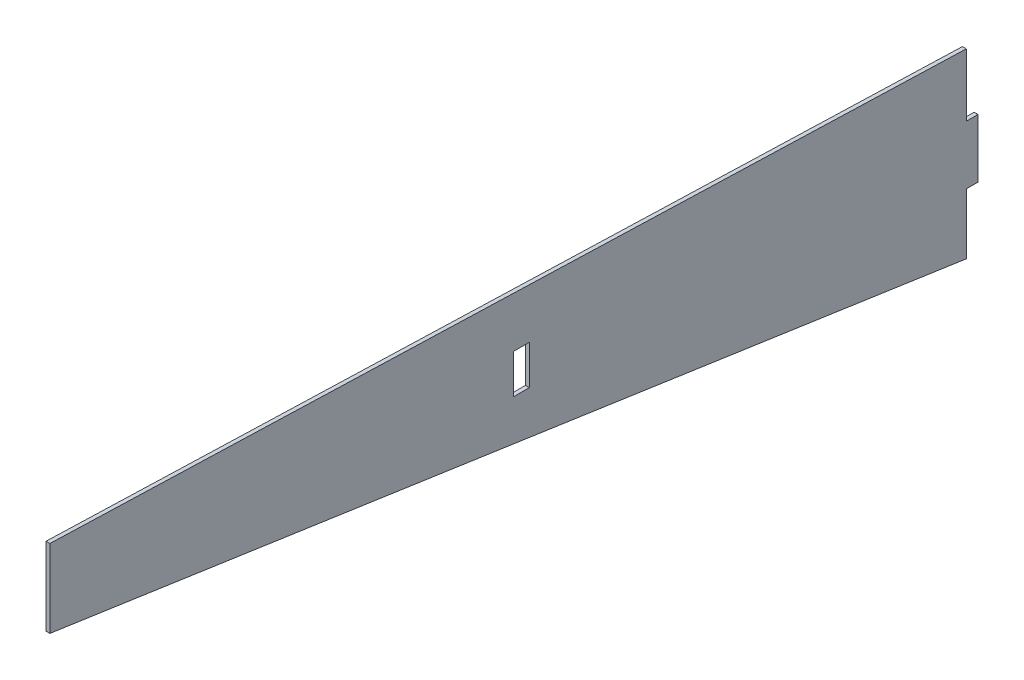
ISO-10303-21;
HEADER;
FILE_DESCRIPTION(('STEP AP214'),'2;1');
FILE_NAME('part.step','',(''),(''),'','','');
FILE_SCHEMA(('AUTOMOTIVE_DESIGN { 1 0 10303 214 1 1 1 1 }'));
ENDSEC;
DATA;
#1=APPLICATION_CONTEXT('core data for automotive mechanical design processes');
#2=APPLICATION_PROTOCOL_DEFINITION('international standard','automotive_design',2000,#1);
#3=PRODUCT_CONTEXT('',#1,'mechanical');
#4=PRODUCT('Part','Part','',(#3));
#5=PRODUCT_RELATED_PRODUCT_CATEGORY('part','',(#4));
#6=PRODUCT_DEFINITION_FORMATION('','',#4);
#7=PRODUCT_DEFINITION_CONTEXT('part definition',#1,'design');
#8=PRODUCT_DEFINITION('design','',#6,#7);
#9=PRODUCT_DEFINITION_SHAPE('','',#8);
#10=(LENGTH_UNIT() NAMED_UNIT(*) SI_UNIT(.MILLI.,.METRE.));
#11=(NAMED_UNIT(*) PLANE_ANGLE_UNIT() SI_UNIT($,.RADIAN.));
#12=(NAMED_UNIT(*) SI_UNIT($,.STERADIAN.) SOLID_ANGLE_UNIT());
#13=UNCERTAINTY_MEASURE_WITH_UNIT(LENGTH_MEASURE(1.E-05),#10,'distance_accuracy_value','');
#14=(GEOMETRIC_REPRESENTATION_CONTEXT(3) GLOBAL_UNCERTAINTY_ASSIGNED_CONTEXT((#13)) GLOBAL_UNIT_ASSIGNED_CONTEXT((#10,
#11,#12)) REPRESENTATION_CONTEXT('',''));
#15=CARTESIAN_POINT('',(0.,0.,0.));
#16=DIRECTION('',(0.,0.,1.));
#17=DIRECTION('',(1.,0.,0.));
#18=AXIS2_PLACEMENT_3D('',#15,#16,#17);
#19=CARTESIAN_POINT('',(1.5875,-55.2341153332028,-378.259807403515));
#20=DIRECTION('',(0.,0.98950635767407,-0.144489335670822));
#21=DIRECTION('',(0.,0.144489335670822,0.98950635767407));
#22=AXIS2_PLACEMENT_3D('',#19,#20,#21);
#23=PLANE('',#22);
#24=DIRECTION('',(0.,-0.144489335670822,-0.98950635767407));
#25=VECTOR('',#24,1.);
#26=CARTESIAN_POINT('',(0.,-55.2341153332028,-378.259807403515));
#27=LINE('',#26,#25);
#28=CARTESIAN_POINT('',(0.,0.,0.));
#29=VERTEX_POINT('',#28);
#30=CARTESIAN_POINT('',(0.,-54.5386872990163,-373.497307403515));
#31=VERTEX_POINT('',#30);
#32=EDGE_CURVE('E175',#29,#31,#27,.T.);
#33=ORIENTED_EDGE('',*,*,#32,.T.);
#34=DIRECTION('',(1.,0.,0.));
#35=VECTOR('',#34,1.);
#36=CARTESIAN_POINT('',(0.,-54.5386872990163,-373.497307403515));
#37=LINE('',#36,#35);
#38=CARTESIAN_POINT('',(1.5875,-54.5386872990163,-373.497307403515));
#39=VERTEX_POINT('',#38);
#40=EDGE_CURVE('E172',#31,#39,#37,.T.);
#41=ORIENTED_EDGE('',*,*,#40,.T.);
#42=DIRECTION('',(0.,-0.144489335670822,-0.98950635767407));
#43=VECTOR('',#42,1.);
#44=CARTESIAN_POINT('',(1.5875,-55.2341153332028,-378.259807403515));
#45=LINE('',#44,#43);
#46=CARTESIAN_POINT('',(1.5875,0.,0.));
#47=VERTEX_POINT('',#46);
#48=EDGE_CURVE('E195',#47,#39,#45,.T.);
#49=ORIENTED_EDGE('',*,*,#48,.F.);
#50=DIRECTION('',(-1.,0.,0.));
#51=VECTOR('',#50,1.);
#52=CARTESIAN_POINT('',(1.5875,0.,0.));
#53=LINE('',#52,#51);
#54=EDGE_CURVE('E40',#47,#29,#53,.T.);
#55=ORIENTED_EDGE('',*,*,#54,.T.);
#56=EDGE_LOOP('',(#33,#41,#49,#55));
#57=FACE_BOUND('',#56,.T.);
#58=ADVANCED_FACE('F33',(#57),#23,.F.);
#59=CARTESIAN_POINT('',(1.5875,19.4418846667972,-378.259807403515));
#60=DIRECTION('',(0.,0.,1.));
#61=DIRECTION('',(1.,0.,0.));
#62=AXIS2_PLACEMENT_3D('',#59,#60,#61);
#63=PLANE('',#62);
#64=DIRECTION('',(0.,1.,0.));
#65=VECTOR('',#64,1.);
#66=CARTESIAN_POINT('',(1.5875,19.4418846667972,-378.259807403515));
#67=LINE('',#66,#65);
#68=CARTESIAN_POINT('',(1.5875,-29.8341153332028,-378.259807403515));
#69=VERTEX_POINT('',#68);
#70=CARTESIAN_POINT('',(1.5875,-5.95811533320283,-378.259807403515));
#71=VERTEX_POINT('',#70);
#72=EDGE_CURVE('E198',#69,#71,#67,.T.);
#73=ORIENTED_EDGE('',*,*,#72,.F.);
#74=DIRECTION('',(1.,0.,0.));
#75=VECTOR('',#74,1.);
#76=CARTESIAN_POINT('',(0.,-29.8341153332028,-378.259807403515));
#77=LINE('',#76,#75);
#78=CARTESIAN_POINT('',(0.,-29.8341153332028,-378.259807403515));
#79=VERTEX_POINT('',#78);
#80=EDGE_CURVE('E166',#79,#69,#77,.T.);
#81=ORIENTED_EDGE('',*,*,#80,.F.);
#82=DIRECTION('',(0.,1.,0.));
#83=VECTOR('',#82,1.);
#84=CARTESIAN_POINT('',(0.,19.4418846667972,-378.259807403515));
#85=LINE('',#84,#83);
#86=CARTESIAN_POINT('',(0.,-5.95811533320283,-378.259807403515));
#87=VERTEX_POINT('',#86);
#88=EDGE_CURVE('E208',#79,#87,#85,.T.);
#89=ORIENTED_EDGE('',*,*,#88,.T.);
#90=DIRECTION('',(1.,0.,0.));
#91=VECTOR('',#90,1.);
#92=CARTESIAN_POINT('',(0.,-5.95811533320283,-378.259807403515));
#93=LINE('',#92,#91);
#94=EDGE_CURVE('E170',#87,#71,#93,.T.);
#95=ORIENTED_EDGE('',*,*,#94,.T.);
#96=EDGE_LOOP('',(#73,#81,#89,#95));
#97=FACE_BOUND('',#96,.T.);
#98=ADVANCED_FACE('F248',(#97),#63,.F.);
#99=CARTESIAN_POINT('',(1.5875,31.75,0.));
#100=DIRECTION('',(0.,-0.999471033672027,0.0325215751551097));
#101=DIRECTION('',(0.,-0.0325215751551097,-0.999471033672027));
#102=AXIS2_PLACEMENT_3D('',#99,#100,#101);
#103=PLANE('',#102);
#104=DIRECTION('',(0.,0.0325215751551097,0.999471033672027));
#105=VECTOR('',#104,1.);
#106=CARTESIAN_POINT('',(1.5875,31.75,0.));
#107=LINE('',#106,#105);
#108=CARTESIAN_POINT('',(1.5875,19.5968506402553,-373.497307403515));
#109=VERTEX_POINT('',#108);
#110=CARTESIAN_POINT('',(1.5875,31.75,0.));
#111=VERTEX_POINT('',#110);
#112=EDGE_CURVE('E202',#109,#111,#107,.T.);
#113=ORIENTED_EDGE('',*,*,#112,.F.);
#114=DIRECTION('',(1.,0.,0.));
#115=VECTOR('',#114,1.);
#116=CARTESIAN_POINT('',(0.,19.5968506402553,-373.497307403515));
#117=LINE('',#116,#115);
#118=CARTESIAN_POINT('',(0.,19.5968506402553,-373.497307403515));
#119=VERTEX_POINT('',#118);
#120=EDGE_CURVE('E186',#119,#109,#117,.T.);
#121=ORIENTED_EDGE('',*,*,#120,.F.);
#122=DIRECTION('',(0.,0.0325215751551097,0.999471033672027));
#123=VECTOR('',#122,1.);
#124=CARTESIAN_POINT('',(0.,31.75,0.));
#125=LINE('',#124,#123);
#126=CARTESIAN_POINT('',(0.,31.75,0.));
#127=VERTEX_POINT('',#126);
#128=EDGE_CURVE('E211',#119,#127,#125,.T.);
#129=ORIENTED_EDGE('',*,*,#128,.T.);
#130=DIRECTION('',(-1.,0.,0.));
#131=VECTOR('',#130,1.);
#132=CARTESIAN_POINT('',(1.5875,31.75,0.));
#133=LINE('',#132,#131);
#134=EDGE_CURVE('E11',#111,#127,#133,.T.);
#135=ORIENTED_EDGE('',*,*,#134,.F.);
#136=EDGE_LOOP('',(#113,#121,#129,#135));
#137=FACE_BOUND('',#136,.T.);
#138=ADVANCED_FACE('F239',(#137),#103,.F.);
#139=CARTESIAN_POINT('',(1.5875,0.,0.));
#140=DIRECTION('',(0.,0.,-1.));
#141=DIRECTION('',(-1.,0.,0.));
#142=AXIS2_PLACEMENT_3D('',#139,#140,#141);
#143=PLANE('',#142);
#144=DIRECTION('',(0.,-1.,0.));
#145=VECTOR('',#144,1.);
#146=CARTESIAN_POINT('',(0.,0.,0.));
#147=LINE('',#146,#145);
#148=EDGE_CURVE('E199',#127,#29,#147,.T.);
#149=ORIENTED_EDGE('',*,*,#148,.T.);
#150=ORIENTED_EDGE('',*,*,#54,.F.);
#151=DIRECTION('',(0.,-1.,0.));
#152=VECTOR('',#151,1.);
#153=CARTESIAN_POINT('',(1.5875,0.,0.));
#154=LINE('',#153,#152);
#155=EDGE_CURVE('E204',#111,#47,#154,.T.);
#156=ORIENTED_EDGE('',*,*,#155,.F.);
#157=ORIENTED_EDGE('',*,*,#134,.T.);
#158=EDGE_LOOP('',(#149,#150,#156,#157));
#159=FACE_BOUND('',#158,.T.);
#160=ADVANCED_FACE('F237',(#159),#143,.F.);
#161=CARTESIAN_POINT('',(1.5875,0.,0.));
#162=DIRECTION('',(-1.,0.,0.));
#163=DIRECTION('',(0.,0.,1.));
#164=AXIS2_PLACEMENT_3D('',#161,#162,#163);
#165=PLANE('',#164);
#166=DIRECTION('',(0.,0.,-1.));
#167=VECTOR('',#166,1.);
#168=CARTESIAN_POINT('',(1.5875,-10.9401762368486,-189.029807403515));
#169=LINE('',#168,#167);
#170=CARTESIAN_POINT('',(1.5875,-10.9401762368486,-189.029807403515));
#171=VERTEX_POINT('',#170);
#172=CARTESIAN_POINT('',(1.5875,-10.9401762368486,-195.379807403515));
#173=VERTEX_POINT('',#172);
#174=EDGE_CURVE('E145',#171,#173,#169,.T.);
#175=ORIENTED_EDGE('',*,*,#174,.F.);
#176=DIRECTION('',(0.,-1.,0.));
#177=VECTOR('',#176,1.);
#178=CARTESIAN_POINT('',(1.5875,5.06182376315141,-189.029807403515));
#179=LINE('',#178,#177);
#180=CARTESIAN_POINT('',(1.5875,5.06182376315141,-189.029807403515));
#181=VERTEX_POINT('',#180);
#182=EDGE_CURVE('E138',#181,#171,#179,.T.);
#183=ORIENTED_EDGE('',*,*,#182,.F.);
#184=DIRECTION('',(0.,0.,1.));
#185=VECTOR('',#184,1.);
#186=CARTESIAN_POINT('',(1.5875,5.0618237631514,-195.379807403515));
#187=LINE('',#186,#185);
#188=CARTESIAN_POINT('',(1.5875,5.0618237631514,-195.379807403515));
#189=VERTEX_POINT('',#188);
#190=EDGE_CURVE('E149',#189,#181,#187,.T.);
#191=ORIENTED_EDGE('',*,*,#190,.F.);
#192=DIRECTION('',(0.,1.,0.));
#193=VECTOR('',#192,1.);
#194=CARTESIAN_POINT('',(1.5875,-10.9401762368486,-195.379807403515));
#195=LINE('',#194,#193);
#196=EDGE_CURVE('E47',#173,#189,#195,.T.);
#197=ORIENTED_EDGE('',*,*,#196,.F.);
#198=EDGE_LOOP('',(#175,#183,#191,#197));
#199=FACE_BOUND('',#198,.T.);
#200=ORIENTED_EDGE('',*,*,#48,.T.);
#201=DIRECTION('',(0.,-1.,0.));
#202=VECTOR('',#201,1.);
#203=CARTESIAN_POINT('',(1.5875,-29.8341153332028,-373.497307403515));
#204=LINE('',#203,#202);
#205=CARTESIAN_POINT('',(1.5875,-29.8341153332028,-373.497307403515));
#206=VERTEX_POINT('',#205);
#207=EDGE_CURVE('E163',#206,#39,#204,.T.);
#208=ORIENTED_EDGE('',*,*,#207,.F.);
#209=DIRECTION('',(0.,0.,1.));
#210=VECTOR('',#209,1.);
#211=CARTESIAN_POINT('',(1.5875,-29.8341153332028,-378.259807403515));
#212=LINE('',#211,#210);
#213=EDGE_CURVE('E167',#69,#206,#212,.T.);
#214=ORIENTED_EDGE('',*,*,#213,.F.);
#215=ORIENTED_EDGE('',*,*,#72,.T.);
#216=DIRECTION('',(0.,0.,-1.));
#217=VECTOR('',#216,1.);
#218=CARTESIAN_POINT('',(1.5875,-5.95811533320283,-373.497307403515));
#219=LINE('',#218,#217);
#220=CARTESIAN_POINT('',(1.5875,-5.95811533320283,-373.497307403515));
#221=VERTEX_POINT('',#220);
#222=EDGE_CURVE('E183',#221,#71,#219,.T.);
#223=ORIENTED_EDGE('',*,*,#222,.F.);
#224=DIRECTION('',(0.,-1.,0.));
#225=VECTOR('',#224,1.);
#226=CARTESIAN_POINT('',(1.5875,19.5968506402553,-373.497307403515));
#227=LINE('',#226,#225);
#228=EDGE_CURVE('E158',#109,#221,#227,.T.);
#229=ORIENTED_EDGE('',*,*,#228,.F.);
#230=ORIENTED_EDGE('',*,*,#112,.T.);
#231=ORIENTED_EDGE('',*,*,#155,.T.);
#232=EDGE_LOOP('',(#200,#208,#214,#215,#223,#229,#230,#231));
#233=FACE_BOUND('',#232,.T.);
#234=ADVANCED_FACE('F233',(#199,#233),#165,.F.);
#235=CARTESIAN_POINT('',(0.,0.,0.));
#236=DIRECTION('',(-1.,0.,0.));
#237=DIRECTION('',(0.,0.,1.));
#238=AXIS2_PLACEMENT_3D('',#235,#236,#237);
#239=PLANE('',#238);
#240=DIRECTION('',(0.,-1.,0.));
#241=VECTOR('',#240,1.);
#242=CARTESIAN_POINT('',(0.,5.06182376315141,-189.029807403515));
#243=LINE('',#242,#241);
#244=CARTESIAN_POINT('',(0.,5.06182376315141,-189.029807403515));
#245=VERTEX_POINT('',#244);
#246=CARTESIAN_POINT('',(0.,-10.9401762368486,-189.029807403515));
#247=VERTEX_POINT('',#246);
#248=EDGE_CURVE('E135',#245,#247,#243,.T.);
#249=ORIENTED_EDGE('',*,*,#248,.T.);
#250=DIRECTION('',(0.,0.,-1.));
#251=VECTOR('',#250,1.);
#252=CARTESIAN_POINT('',(0.,-10.9401762368486,-189.029807403515));
#253=LINE('',#252,#251);
#254=CARTESIAN_POINT('',(0.,-10.9401762368486,-195.379807403515));
#255=VERTEX_POINT('',#254);
#256=EDGE_CURVE('E122',#247,#255,#253,.T.);
#257=ORIENTED_EDGE('',*,*,#256,.T.);
#258=DIRECTION('',(0.,1.,0.));
#259=VECTOR('',#258,1.);
#260=CARTESIAN_POINT('',(0.,-10.9401762368486,-195.379807403515));
#261=LINE('',#260,#259);
#262=CARTESIAN_POINT('',(0.,5.0618237631514,-195.379807403515));
#263=VERTEX_POINT('',#262);
#264=EDGE_CURVE('E153',#255,#263,#261,.T.);
#265=ORIENTED_EDGE('',*,*,#264,.T.);
#266=DIRECTION('',(0.,0.,1.));
#267=VECTOR('',#266,1.);
#268=CARTESIAN_POINT('',(0.,5.0618237631514,-195.379807403515));
#269=LINE('',#268,#267);
#270=EDGE_CURVE('E143',#263,#245,#269,.T.);
#271=ORIENTED_EDGE('',*,*,#270,.T.);
#272=EDGE_LOOP('',(#249,#257,#265,#271));
#273=FACE_BOUND('',#272,.T.);
#274=DIRECTION('',(0.,-1.,0.));
#275=VECTOR('',#274,1.);
#276=CARTESIAN_POINT('',(0.,-29.8341153332028,-373.497307403515));
#277=LINE('',#276,#275);
#278=CARTESIAN_POINT('',(0.,-29.8341153332028,-373.497307403515));
#279=VERTEX_POINT('',#278);
#280=EDGE_CURVE('E162',#279,#31,#277,.T.);
#281=ORIENTED_EDGE('',*,*,#280,.T.);
#282=ORIENTED_EDGE('',*,*,#32,.F.);
#283=ORIENTED_EDGE('',*,*,#148,.F.);
#284=ORIENTED_EDGE('',*,*,#128,.F.);
#285=DIRECTION('',(0.,-1.,0.));
#286=VECTOR('',#285,1.);
#287=CARTESIAN_POINT('',(0.,19.5968506402553,-373.497307403515));
#288=LINE('',#287,#286);
#289=CARTESIAN_POINT('',(0.,-5.95811533320283,-373.497307403515));
#290=VERTEX_POINT('',#289);
#291=EDGE_CURVE('E179',#119,#290,#288,.T.);
#292=ORIENTED_EDGE('',*,*,#291,.T.);
#293=DIRECTION('',(0.,0.,-1.));
#294=VECTOR('',#293,1.);
#295=CARTESIAN_POINT('',(0.,-5.95811533320283,-373.497307403515));
#296=LINE('',#295,#294);
#297=EDGE_CURVE('E182',#290,#87,#296,.T.);
#298=ORIENTED_EDGE('',*,*,#297,.T.);
#299=ORIENTED_EDGE('',*,*,#88,.F.);
#300=DIRECTION('',(0.,0.,1.));
#301=VECTOR('',#300,1.);
#302=CARTESIAN_POINT('',(0.,-29.8341153332028,-378.259807403515));
#303=LINE('',#302,#301);
#304=EDGE_CURVE('E159',#79,#279,#303,.T.);
#305=ORIENTED_EDGE('',*,*,#304,.T.);
#306=EDGE_LOOP('',(#281,#282,#283,#284,#292,#298,#299,#305));
#307=FACE_BOUND('',#306,.T.);
#308=ADVANCED_FACE('F141',(#273,#307),#239,.T.);
#309=CARTESIAN_POINT('',(0.,-5.95811533320283,-373.497307403515));
#310=DIRECTION('',(0.,-1.,0.));
#311=DIRECTION('',(0.,0.,-1.));
#312=AXIS2_PLACEMENT_3D('',#309,#310,#311);
#313=PLANE('',#312);
#314=ORIENTED_EDGE('',*,*,#222,.T.);
#315=ORIENTED_EDGE('',*,*,#94,.F.);
#316=ORIENTED_EDGE('',*,*,#297,.F.);
#317=DIRECTION('',(1.,0.,0.));
#318=VECTOR('',#317,1.);
#319=CARTESIAN_POINT('',(0.,-5.95811533320283,-373.497307403515));
#320=LINE('',#319,#318);
#321=EDGE_CURVE('E192',#290,#221,#320,.T.);
#322=ORIENTED_EDGE('',*,*,#321,.T.);
#323=EDGE_LOOP('',(#314,#315,#316,#322));
#324=FACE_BOUND('',#323,.T.);
#325=ADVANCED_FACE('F246',(#324),#313,.F.);
#326=CARTESIAN_POINT('',(0.,19.5968506402553,-373.497307403515));
#327=DIRECTION('',(0.,0.,1.));
#328=DIRECTION('',(1.,0.,0.));
#329=AXIS2_PLACEMENT_3D('',#326,#327,#328);
#330=PLANE('',#329);
#331=ORIENTED_EDGE('',*,*,#228,.T.);
#332=ORIENTED_EDGE('',*,*,#321,.F.);
#333=ORIENTED_EDGE('',*,*,#291,.F.);
#334=ORIENTED_EDGE('',*,*,#120,.T.);
#335=EDGE_LOOP('',(#331,#332,#333,#334));
#336=FACE_BOUND('',#335,.T.);
#337=ADVANCED_FACE('F243',(#336),#330,.F.);
#338=CARTESIAN_POINT('',(0.,-29.8341153332028,-373.497307403515));
#339=DIRECTION('',(0.,0.,1.));
#340=DIRECTION('',(1.,0.,0.));
#341=AXIS2_PLACEMENT_3D('',#338,#339,#340);
#342=PLANE('',#341);
#343=ORIENTED_EDGE('',*,*,#207,.T.);
#344=ORIENTED_EDGE('',*,*,#40,.F.);
#345=ORIENTED_EDGE('',*,*,#280,.F.);
#346=DIRECTION('',(1.,0.,0.));
#347=VECTOR('',#346,1.);
#348=CARTESIAN_POINT('',(0.,-29.8341153332028,-373.497307403515));
#349=LINE('',#348,#347);
#350=EDGE_CURVE('E176',#279,#206,#349,.T.);
#351=ORIENTED_EDGE('',*,*,#350,.T.);
#352=EDGE_LOOP('',(#343,#344,#345,#351));
#353=FACE_BOUND('',#352,.T.);
#354=ADVANCED_FACE('F225',(#353),#342,.F.);
#355=CARTESIAN_POINT('',(0.,-29.8341153332028,-378.259807403515));
#356=DIRECTION('',(0.,1.,0.));
#357=DIRECTION('',(0.,0.,1.));
#358=AXIS2_PLACEMENT_3D('',#355,#356,#357);
#359=PLANE('',#358);
#360=ORIENTED_EDGE('',*,*,#213,.T.);
#361=ORIENTED_EDGE('',*,*,#350,.F.);
#362=ORIENTED_EDGE('',*,*,#304,.F.);
#363=ORIENTED_EDGE('',*,*,#80,.T.);
#364=EDGE_LOOP('',(#360,#361,#362,#363));
#365=FACE_BOUND('',#364,.T.);
#366=ADVANCED_FACE('F227',(#365),#359,.F.);
#367=CARTESIAN_POINT('',(-17.2158794140758,5.06182376315141,-189.029807403515));
#368=DIRECTION('',(0.,0.,1.));
#369=DIRECTION('',(1.,0.,0.));
#370=AXIS2_PLACEMENT_3D('',#367,#368,#369);
#371=PLANE('',#370);
#372=DIRECTION('',(1.,0.,0.));
#373=VECTOR('',#372,1.);
#374=CARTESIAN_POINT('',(-17.2158794140758,5.06182376315141,-189.029807403515));
#375=LINE('',#374,#373);
#376=EDGE_CURVE('E55',#245,#181,#375,.T.);
#377=ORIENTED_EDGE('',*,*,#376,.T.);
#378=ORIENTED_EDGE('',*,*,#182,.T.);
#379=DIRECTION('',(1.,0.,0.));
#380=VECTOR('',#379,1.);
#381=CARTESIAN_POINT('',(-17.2158794140758,-10.9401762368486,-189.029807403515));
#382=LINE('',#381,#380);
#383=EDGE_CURVE('E126',#247,#171,#382,.T.);
#384=ORIENTED_EDGE('',*,*,#383,.F.);
#385=ORIENTED_EDGE('',*,*,#248,.F.);
#386=EDGE_LOOP('',(#377,#378,#384,#385));
#387=FACE_BOUND('',#386,.T.);
#388=ADVANCED_FACE('F134',(#387),#371,.F.);
#389=CARTESIAN_POINT('',(-17.2158794140758,-10.9401762368486,-189.029807403515));
#390=DIRECTION('',(0.,-1.,0.));
#391=DIRECTION('',(0.,0.,-1.));
#392=AXIS2_PLACEMENT_3D('',#389,#390,#391);
#393=PLANE('',#392);
#394=ORIENTED_EDGE('',*,*,#383,.T.);
#395=ORIENTED_EDGE('',*,*,#174,.T.);
#396=DIRECTION('',(1.,0.,0.));
#397=VECTOR('',#396,1.);
#398=CARTESIAN_POINT('',(-17.2158794140758,-10.9401762368486,-195.379807403515));
#399=LINE('',#398,#397);
#400=EDGE_CURVE('E128',#255,#173,#399,.T.);
#401=ORIENTED_EDGE('',*,*,#400,.F.);
#402=ORIENTED_EDGE('',*,*,#256,.F.);
#403=EDGE_LOOP('',(#394,#395,#401,#402));
#404=FACE_BOUND('',#403,.T.);
#405=ADVANCED_FACE('F124',(#404),#393,.F.);
#406=CARTESIAN_POINT('',(-17.2158794140758,-10.9401762368486,-195.379807403515));
#407=DIRECTION('',(0.,0.,-1.));
#408=DIRECTION('',(-1.,0.,0.));
#409=AXIS2_PLACEMENT_3D('',#406,#407,#408);
#410=PLANE('',#409);
#411=ORIENTED_EDGE('',*,*,#400,.T.);
#412=ORIENTED_EDGE('',*,*,#196,.T.);
#413=DIRECTION('',(1.,0.,0.));
#414=VECTOR('',#413,1.);
#415=CARTESIAN_POINT('',(-17.2158794140758,5.0618237631514,-195.379807403515));
#416=LINE('',#415,#414);
#417=EDGE_CURVE('E152',#263,#189,#416,.T.);
#418=ORIENTED_EDGE('',*,*,#417,.F.);
#419=ORIENTED_EDGE('',*,*,#264,.F.);
#420=EDGE_LOOP('',(#411,#412,#418,#419));
#421=FACE_BOUND('',#420,.T.);
#422=ADVANCED_FACE('F275',(#421),#410,.F.);
#423=CARTESIAN_POINT('',(-17.2158794140758,5.0618237631514,-195.379807403515));
#424=DIRECTION('',(0.,1.,0.));
#425=DIRECTION('',(0.,0.,1.));
#426=AXIS2_PLACEMENT_3D('',#423,#424,#425);
#427=PLANE('',#426);
#428=ORIENTED_EDGE('',*,*,#417,.T.);
#429=ORIENTED_EDGE('',*,*,#190,.T.);
#430=ORIENTED_EDGE('',*,*,#376,.F.);
#431=ORIENTED_EDGE('',*,*,#270,.F.);
#432=EDGE_LOOP('',(#428,#429,#430,#431));
#433=FACE_BOUND('',#432,.T.);
#434=ADVANCED_FACE('F278',(#433),#427,.F.);
#435=CLOSED_SHELL('',(#58,#98,#138,#160,#234,#308,#325,#337,#354,#366,#388,#405,#422,#434));
#436=MANIFOLD_SOLID_BREP('B2',#435);
#437=ADVANCED_BREP_SHAPE_REPRESENTATION('',(#18,#436),#14);
#438=SHAPE_DEFINITION_REPRESENTATION(#9,#437);
ENDSEC;
END-ISO-10303-21;
